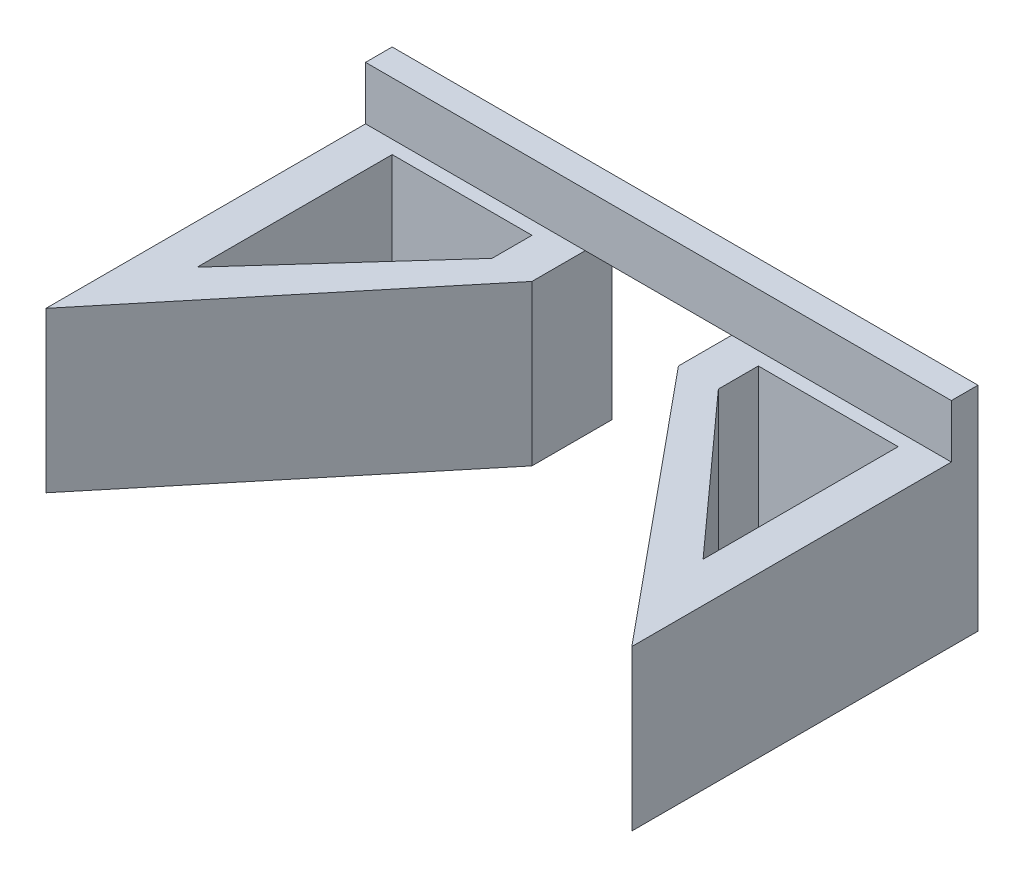
ISO-10303-21;
HEADER;
FILE_DESCRIPTION(('STEP AP214'),'2;1');
FILE_NAME('part.step','',(''),(''),'','','');
FILE_SCHEMA(('AUTOMOTIVE_DESIGN { 1 0 10303 214 1 1 1 1 }'));
ENDSEC;
DATA;
#1=APPLICATION_CONTEXT('core data for automotive mechanical design processes');
#2=APPLICATION_PROTOCOL_DEFINITION('international standard','automotive_design',2000,#1);
#3=PRODUCT_CONTEXT('',#1,'mechanical');
#4=PRODUCT('Part','Part','',(#3));
#5=PRODUCT_RELATED_PRODUCT_CATEGORY('part','',(#4));
#6=PRODUCT_DEFINITION_FORMATION('','',#4);
#7=PRODUCT_DEFINITION_CONTEXT('part definition',#1,'design');
#8=PRODUCT_DEFINITION('design','',#6,#7);
#9=PRODUCT_DEFINITION_SHAPE('','',#8);
#10=(LENGTH_UNIT() NAMED_UNIT(*) SI_UNIT(.MILLI.,.METRE.));
#11=(NAMED_UNIT(*) PLANE_ANGLE_UNIT() SI_UNIT($,.RADIAN.));
#12=(NAMED_UNIT(*) SI_UNIT($,.STERADIAN.) SOLID_ANGLE_UNIT());
#13=UNCERTAINTY_MEASURE_WITH_UNIT(LENGTH_MEASURE(1.E-05),#10,'distance_accuracy_value','');
#14=(GEOMETRIC_REPRESENTATION_CONTEXT(3) GLOBAL_UNCERTAINTY_ASSIGNED_CONTEXT((#13)) GLOBAL_UNIT_ASSIGNED_CONTEXT((#10,
#11,#12)) REPRESENTATION_CONTEXT('',''));
#15=CARTESIAN_POINT('',(0.,0.,0.));
#16=DIRECTION('',(0.,0.,1.));
#17=DIRECTION('',(1.,0.,0.));
#18=AXIS2_PLACEMENT_3D('',#15,#16,#17);
#19=CARTESIAN_POINT('',(0.,60.,0.));
#20=DIRECTION('',(0.,1.,0.));
#21=DIRECTION('',(0.,0.,1.));
#22=AXIS2_PLACEMENT_3D('',#19,#20,#21);
#23=PLANE('',#22);
#24=DIRECTION('',(0.,0.,1.));
#25=VECTOR('',#24,1.);
#26=CARTESIAN_POINT('',(27.5,60.,-12.7008032128514));
#27=LINE('',#26,#25);
#28=CARTESIAN_POINT('',(27.5,60.,-42.7008032128514));
#29=VERTEX_POINT('',#28);
#30=CARTESIAN_POINT('',(27.5,60.,-32.7008032128514));
#31=VERTEX_POINT('',#30);
#32=EDGE_CURVE('E215',#29,#31,#27,.T.);
#33=ORIENTED_EDGE('',*,*,#32,.T.);
#34=DIRECTION('',(1.,0.,0.));
#35=VECTOR('',#34,1.);
#36=CARTESIAN_POINT('',(-110.,60.,-32.7008032128514));
#37=LINE('',#36,#35);
#38=CARTESIAN_POINT('',(-27.5,60.,-32.7008032128514));
#39=VERTEX_POINT('',#38);
#40=EDGE_CURVE('E239',#39,#31,#37,.T.);
#41=ORIENTED_EDGE('',*,*,#40,.F.);
#42=DIRECTION('',(0.,0.,-1.));
#43=VECTOR('',#42,1.);
#44=CARTESIAN_POINT('',(-27.5,60.,-12.7008032128514));
#45=LINE('',#44,#43);
#46=CARTESIAN_POINT('',(-27.5,60.,-42.7008032128514));
#47=VERTEX_POINT('',#46);
#48=EDGE_CURVE('E296',#39,#47,#45,.T.);
#49=ORIENTED_EDGE('',*,*,#48,.T.);
#50=DIRECTION('',(-1.,0.,0.));
#51=VECTOR('',#50,1.);
#52=CARTESIAN_POINT('',(-110.,60.,-42.7008032128514));
#53=LINE('',#52,#51);
#54=EDGE_CURVE('E244',#29,#47,#53,.T.);
#55=ORIENTED_EDGE('',*,*,#54,.F.);
#56=EDGE_LOOP('',(#33,#41,#49,#55));
#57=FACE_BOUND('',#56,.T.);
#58=ADVANCED_FACE('F36',(#57),#23,.F.);
#59=CARTESIAN_POINT('',(0.,60.,0.));
#60=DIRECTION('',(0.,1.,0.));
#61=DIRECTION('',(0.,0.,1.));
#62=AXIS2_PLACEMENT_3D('',#59,#60,#61);
#63=PLANE('',#62);
#64=CARTESIAN_POINT('',(-110.,60.,-32.7008032128514));
#65=VERTEX_POINT('',#64);
#66=EDGE_CURVE('E51',#65,#39,#37,.T.);
#67=ORIENTED_EDGE('',*,*,#66,.F.);
#68=DIRECTION('',(0.,0.,1.));
#69=VECTOR('',#68,1.);
#70=CARTESIAN_POINT('',(-110.,60.,-42.7008032128514));
#71=LINE('',#70,#69);
#72=CARTESIAN_POINT('',(-110.,60.,87.2991967871486));
#73=VERTEX_POINT('',#72);
#74=EDGE_CURVE('E291',#65,#73,#71,.T.);
#75=ORIENTED_EDGE('',*,*,#74,.T.);
#76=DIRECTION('',(0.636382954795564,0.,-0.771373278540077));
#77=VECTOR('',#76,1.);
#78=CARTESIAN_POINT('',(-110.,60.,87.2991967871486));
#79=LINE('',#78,#77);
#80=CARTESIAN_POINT('',(-27.5,60.,-12.7008032128514));
#81=VERTEX_POINT('',#80);
#82=EDGE_CURVE('E293',#73,#81,#79,.T.);
#83=ORIENTED_EDGE('',*,*,#82,.T.);
#84=EDGE_CURVE('E297',#81,#39,#45,.T.);
#85=ORIENTED_EDGE('',*,*,#84,.T.);
#86=EDGE_LOOP('',(#67,#75,#83,#85));
#87=FACE_BOUND('',#86,.T.);
#88=DIRECTION('',(0.,0.,1.));
#89=VECTOR('',#88,1.);
#90=CARTESIAN_POINT('',(-95.,60.,-27.7008032128514));
#91=LINE('',#90,#89);
#92=CARTESIAN_POINT('',(-95.,60.,-27.7008032128514));
#93=VERTEX_POINT('',#92);
#94=CARTESIAN_POINT('',(-95.,60.,45.5466655826683));
#95=VERTEX_POINT('',#94);
#96=EDGE_CURVE('E264',#93,#95,#91,.T.);
#97=ORIENTED_EDGE('',*,*,#96,.F.);
#98=DIRECTION('',(-1.,0.,0.));
#99=VECTOR('',#98,1.);
#100=CARTESIAN_POINT('',(-42.5,60.,-27.7008032128514));
#101=LINE('',#100,#99);
#102=CARTESIAN_POINT('',(-42.5,60.,-27.7008032128514));
#103=VERTEX_POINT('',#102);
#104=EDGE_CURVE('E262',#103,#93,#101,.T.);
#105=ORIENTED_EDGE('',*,*,#104,.F.);
#106=DIRECTION('',(0.,0.,-1.));
#107=VECTOR('',#106,1.);
#108=CARTESIAN_POINT('',(-42.5,60.,-12.7008032128502));
#109=LINE('',#108,#107);
#110=CARTESIAN_POINT('',(-42.5,60.,-12.7008032128502));
#111=VERTEX_POINT('',#110);
#112=EDGE_CURVE('E269',#111,#103,#109,.T.);
#113=ORIENTED_EDGE('',*,*,#112,.F.);
#114=DIRECTION('',(0.669509023335629,0.,-0.742803922763048));
#115=VECTOR('',#114,1.);
#116=CARTESIAN_POINT('',(-95.,60.,45.5466655826683));
#117=LINE('',#116,#115);
#118=EDGE_CURVE('E267',#95,#111,#117,.T.);
#119=ORIENTED_EDGE('',*,*,#118,.F.);
#120=EDGE_LOOP('',(#97,#105,#113,#119));
#121=FACE_BOUND('',#120,.T.);
#122=ADVANCED_FACE('F375',(#87,#121),#63,.T.);
#123=CARTESIAN_POINT('',(0.,0.,0.));
#124=DIRECTION('',(0.,1.,0.));
#125=DIRECTION('',(0.,0.,1.));
#126=AXIS2_PLACEMENT_3D('',#123,#124,#125);
#127=PLANE('',#126);
#128=DIRECTION('',(0.,0.,1.));
#129=VECTOR('',#128,1.);
#130=CARTESIAN_POINT('',(-110.,0.,-12.7008032128514));
#131=LINE('',#130,#129);
#132=CARTESIAN_POINT('',(-110.,0.,-42.7008032128514));
#133=VERTEX_POINT('',#132);
#134=CARTESIAN_POINT('',(-110.,0.,87.2991967871486));
#135=VERTEX_POINT('',#134);
#136=EDGE_CURVE('E290',#133,#135,#131,.T.);
#137=ORIENTED_EDGE('',*,*,#136,.F.);
#138=DIRECTION('',(-1.,0.,0.));
#139=VECTOR('',#138,1.);
#140=CARTESIAN_POINT('',(-110.,0.,-42.7008032128514));
#141=LINE('',#140,#139);
#142=CARTESIAN_POINT('',(-27.5,0.,-42.7008032128514));
#143=VERTEX_POINT('',#142);
#144=EDGE_CURVE('E294',#143,#133,#141,.T.);
#145=ORIENTED_EDGE('',*,*,#144,.F.);
#146=DIRECTION('',(0.,0.,-1.));
#147=VECTOR('',#146,1.);
#148=CARTESIAN_POINT('',(-27.5,0.,-12.7008032128514));
#149=LINE('',#148,#147);
#150=CARTESIAN_POINT('',(-27.5,0.,-12.7008032128514));
#151=VERTEX_POINT('',#150);
#152=EDGE_CURVE('E303',#151,#143,#149,.T.);
#153=ORIENTED_EDGE('',*,*,#152,.F.);
#154=DIRECTION('',(0.636382954795564,0.,-0.771373278540077));
#155=VECTOR('',#154,1.);
#156=CARTESIAN_POINT('',(-110.,0.,87.2991967871486));
#157=LINE('',#156,#155);
#158=EDGE_CURVE('E301',#135,#151,#157,.T.);
#159=ORIENTED_EDGE('',*,*,#158,.F.);
#160=EDGE_LOOP('',(#137,#145,#153,#159));
#161=FACE_BOUND('',#160,.T.);
#162=DIRECTION('',(-1.,0.,0.));
#163=VECTOR('',#162,1.);
#164=CARTESIAN_POINT('',(-42.5,0.,-27.7008032128514));
#165=LINE('',#164,#163);
#166=CARTESIAN_POINT('',(-42.5,0.,-27.7008032128514));
#167=VERTEX_POINT('',#166);
#168=CARTESIAN_POINT('',(-95.,0.,-27.7008032128514));
#169=VERTEX_POINT('',#168);
#170=EDGE_CURVE('E261',#167,#169,#165,.T.);
#171=ORIENTED_EDGE('',*,*,#170,.T.);
#172=DIRECTION('',(0.,0.,1.));
#173=VECTOR('',#172,1.);
#174=CARTESIAN_POINT('',(-95.,0.,-27.7008032128514));
#175=LINE('',#174,#173);
#176=CARTESIAN_POINT('',(-95.,0.,45.5466655826683));
#177=VERTEX_POINT('',#176);
#178=EDGE_CURVE('E274',#169,#177,#175,.T.);
#179=ORIENTED_EDGE('',*,*,#178,.T.);
#180=DIRECTION('',(0.669509023335629,0.,-0.742803922763048));
#181=VECTOR('',#180,1.);
#182=CARTESIAN_POINT('',(-95.,0.,45.5466655826683));
#183=LINE('',#182,#181);
#184=CARTESIAN_POINT('',(-42.5,0.,-12.7008032128502));
#185=VERTEX_POINT('',#184);
#186=EDGE_CURVE('E277',#177,#185,#183,.T.);
#187=ORIENTED_EDGE('',*,*,#186,.T.);
#188=DIRECTION('',(0.,0.,-1.));
#189=VECTOR('',#188,1.);
#190=CARTESIAN_POINT('',(-42.5,0.,-12.7008032128502));
#191=LINE('',#190,#189);
#192=EDGE_CURVE('E265',#185,#167,#191,.T.);
#193=ORIENTED_EDGE('',*,*,#192,.T.);
#194=EDGE_LOOP('',(#171,#179,#187,#193));
#195=FACE_BOUND('',#194,.T.);
#196=ADVANCED_FACE('F324',(#161,#195),#127,.F.);
#197=CARTESIAN_POINT('',(-110.,60.,-12.7008032128514));
#198=DIRECTION('',(1.,0.,0.));
#199=DIRECTION('',(0.,0.,-1.));
#200=AXIS2_PLACEMENT_3D('',#197,#198,#199);
#201=PLANE('',#200);
#202=ORIENTED_EDGE('',*,*,#136,.T.);
#203=DIRECTION('',(0.,-1.,0.));
#204=VECTOR('',#203,1.);
#205=CARTESIAN_POINT('',(-110.,60.,87.2991967871486));
#206=LINE('',#205,#204);
#207=EDGE_CURVE('E11',#73,#135,#206,.T.);
#208=ORIENTED_EDGE('',*,*,#207,.F.);
#209=ORIENTED_EDGE('',*,*,#74,.F.);
#210=DIRECTION('',(0.,-1.,0.));
#211=VECTOR('',#210,1.);
#212=CARTESIAN_POINT('',(-110.,80.,-32.7008032128514));
#213=LINE('',#212,#211);
#214=CARTESIAN_POINT('',(-110.,80.,-32.7008032128514));
#215=VERTEX_POINT('',#214);
#216=EDGE_CURVE('E258',#215,#65,#213,.T.);
#217=ORIENTED_EDGE('',*,*,#216,.F.);
#218=DIRECTION('',(0.,0.,1.));
#219=VECTOR('',#218,1.);
#220=CARTESIAN_POINT('',(-110.,80.,-42.7008032128514));
#221=LINE('',#220,#219);
#222=CARTESIAN_POINT('',(-110.,80.,-42.7008032128514));
#223=VERTEX_POINT('',#222);
#224=EDGE_CURVE('E240',#223,#215,#221,.T.);
#225=ORIENTED_EDGE('',*,*,#224,.F.);
#226=DIRECTION('',(0.,-1.,0.));
#227=VECTOR('',#226,1.);
#228=CARTESIAN_POINT('',(-110.,60.,-42.7008032128514));
#229=LINE('',#228,#227);
#230=EDGE_CURVE('E299',#223,#133,#229,.T.);
#231=ORIENTED_EDGE('',*,*,#230,.T.);
#232=EDGE_LOOP('',(#202,#208,#209,#217,#225,#231));
#233=FACE_BOUND('',#232,.T.);
#234=ADVANCED_FACE('F38',(#233),#201,.F.);
#235=CARTESIAN_POINT('',(-110.,60.,87.2991967871486));
#236=DIRECTION('',(-0.771373278540077,0.,-0.636382954795564));
#237=DIRECTION('',(-0.636382954795564,0.,0.771373278540077));
#238=AXIS2_PLACEMENT_3D('',#235,#236,#237);
#239=PLANE('',#238);
#240=ORIENTED_EDGE('',*,*,#158,.T.);
#241=DIRECTION('',(0.,-1.,0.));
#242=VECTOR('',#241,1.);
#243=CARTESIAN_POINT('',(-27.5,60.,-12.7008032128514));
#244=LINE('',#243,#242);
#245=EDGE_CURVE('E44',#81,#151,#244,.T.);
#246=ORIENTED_EDGE('',*,*,#245,.F.);
#247=ORIENTED_EDGE('',*,*,#82,.F.);
#248=ORIENTED_EDGE('',*,*,#207,.T.);
#249=EDGE_LOOP('',(#240,#246,#247,#248));
#250=FACE_BOUND('',#249,.T.);
#251=ADVANCED_FACE('F469',(#250),#239,.F.);
#252=CARTESIAN_POINT('',(-27.5,60.,-12.7008032128514));
#253=DIRECTION('',(-1.,0.,0.));
#254=DIRECTION('',(0.,0.,1.));
#255=AXIS2_PLACEMENT_3D('',#252,#253,#254);
#256=PLANE('',#255);
#257=ORIENTED_EDGE('',*,*,#152,.T.);
#258=DIRECTION('',(0.,-1.,0.));
#259=VECTOR('',#258,1.);
#260=CARTESIAN_POINT('',(-27.5,60.,-42.7008032128514));
#261=LINE('',#260,#259);
#262=EDGE_CURVE('E309',#47,#143,#261,.T.);
#263=ORIENTED_EDGE('',*,*,#262,.F.);
#264=ORIENTED_EDGE('',*,*,#48,.F.);
#265=ORIENTED_EDGE('',*,*,#84,.F.);
#266=ORIENTED_EDGE('',*,*,#245,.T.);
#267=EDGE_LOOP('',(#257,#263,#264,#265,#266));
#268=FACE_BOUND('',#267,.T.);
#269=ADVANCED_FACE('F316',(#268),#256,.F.);
#270=CARTESIAN_POINT('',(-110.,60.,-42.7008032128514));
#271=DIRECTION('',(0.,0.,1.));
#272=DIRECTION('',(1.,0.,0.));
#273=AXIS2_PLACEMENT_3D('',#270,#271,#272);
#274=PLANE('',#273);
#275=ORIENTED_EDGE('',*,*,#144,.T.);
#276=ORIENTED_EDGE('',*,*,#230,.F.);
#277=DIRECTION('',(-1.,0.,0.));
#278=VECTOR('',#277,1.);
#279=CARTESIAN_POINT('',(-110.,80.,-42.7008032128514));
#280=LINE('',#279,#278);
#281=CARTESIAN_POINT('',(110.,80.,-42.7008032128514));
#282=VERTEX_POINT('',#281);
#283=EDGE_CURVE('E248',#282,#223,#280,.T.);
#284=ORIENTED_EDGE('',*,*,#283,.F.);
#285=DIRECTION('',(0.,-1.,0.));
#286=VECTOR('',#285,1.);
#287=CARTESIAN_POINT('',(110.,80.,-42.7008032128514));
#288=LINE('',#287,#286);
#289=CARTESIAN_POINT('',(110.,0.,-42.7008032128514));
#290=VERTEX_POINT('',#289);
#291=EDGE_CURVE('E251',#282,#290,#288,.T.);
#292=ORIENTED_EDGE('',*,*,#291,.T.);
#293=DIRECTION('',(-1.,0.,0.));
#294=VECTOR('',#293,1.);
#295=CARTESIAN_POINT('',(110.,0.,-42.7008032128514));
#296=LINE('',#295,#294);
#297=CARTESIAN_POINT('',(27.5,0.,-42.7008032128514));
#298=VERTEX_POINT('',#297);
#299=EDGE_CURVE('E186',#290,#298,#296,.T.);
#300=ORIENTED_EDGE('',*,*,#299,.T.);
#301=DIRECTION('',(0.,-1.,0.));
#302=VECTOR('',#301,1.);
#303=CARTESIAN_POINT('',(27.5,60.,-42.7008032128514));
#304=LINE('',#303,#302);
#305=EDGE_CURVE('E234',#29,#298,#304,.T.);
#306=ORIENTED_EDGE('',*,*,#305,.F.);
#307=ORIENTED_EDGE('',*,*,#54,.T.);
#308=ORIENTED_EDGE('',*,*,#262,.T.);
#309=EDGE_LOOP('',(#275,#276,#284,#292,#300,#306,#307,#308));
#310=FACE_BOUND('',#309,.T.);
#311=ADVANCED_FACE('F327',(#310),#274,.F.);
#312=CARTESIAN_POINT('',(-42.5,60.,-27.7008032128514));
#313=DIRECTION('',(0.,0.,1.));
#314=DIRECTION('',(1.,0.,0.));
#315=AXIS2_PLACEMENT_3D('',#312,#313,#314);
#316=PLANE('',#315);
#317=ORIENTED_EDGE('',*,*,#170,.F.);
#318=DIRECTION('',(0.,-1.,0.));
#319=VECTOR('',#318,1.);
#320=CARTESIAN_POINT('',(-42.5,60.,-27.7008032128514));
#321=LINE('',#320,#319);
#322=EDGE_CURVE('E271',#103,#167,#321,.T.);
#323=ORIENTED_EDGE('',*,*,#322,.F.);
#324=ORIENTED_EDGE('',*,*,#104,.T.);
#325=DIRECTION('',(0.,-1.,0.));
#326=VECTOR('',#325,1.);
#327=CARTESIAN_POINT('',(-95.,60.,-27.7008032128514));
#328=LINE('',#327,#326);
#329=EDGE_CURVE('E287',#93,#169,#328,.T.);
#330=ORIENTED_EDGE('',*,*,#329,.T.);
#331=EDGE_LOOP('',(#317,#323,#324,#330));
#332=FACE_BOUND('',#331,.T.);
#333=ADVANCED_FACE('F457',(#332),#316,.T.);
#334=CARTESIAN_POINT('',(-95.,60.,-27.7008032128514));
#335=DIRECTION('',(1.,0.,0.));
#336=DIRECTION('',(0.,0.,-1.));
#337=AXIS2_PLACEMENT_3D('',#334,#335,#336);
#338=PLANE('',#337);
#339=ORIENTED_EDGE('',*,*,#178,.F.);
#340=ORIENTED_EDGE('',*,*,#329,.F.);
#341=ORIENTED_EDGE('',*,*,#96,.T.);
#342=DIRECTION('',(0.,-1.,0.));
#343=VECTOR('',#342,1.);
#344=CARTESIAN_POINT('',(-95.,60.,45.5466655826683));
#345=LINE('',#344,#343);
#346=EDGE_CURVE('E285',#95,#177,#345,.T.);
#347=ORIENTED_EDGE('',*,*,#346,.T.);
#348=EDGE_LOOP('',(#339,#340,#341,#347));
#349=FACE_BOUND('',#348,.T.);
#350=ADVANCED_FACE('F506',(#349),#338,.T.);
#351=CARTESIAN_POINT('',(-95.,60.,45.5466655826683));
#352=DIRECTION('',(-0.742803922763048,0.,-0.669509023335629));
#353=DIRECTION('',(-0.669509023335629,0.,0.742803922763048));
#354=AXIS2_PLACEMENT_3D('',#351,#352,#353);
#355=PLANE('',#354);
#356=ORIENTED_EDGE('',*,*,#186,.F.);
#357=ORIENTED_EDGE('',*,*,#346,.F.);
#358=ORIENTED_EDGE('',*,*,#118,.T.);
#359=DIRECTION('',(0.,-1.,0.));
#360=VECTOR('',#359,1.);
#361=CARTESIAN_POINT('',(-42.5,60.,-12.7008032128502));
#362=LINE('',#361,#360);
#363=EDGE_CURVE('E59',#111,#185,#362,.T.);
#364=ORIENTED_EDGE('',*,*,#363,.T.);
#365=EDGE_LOOP('',(#356,#357,#358,#364));
#366=FACE_BOUND('',#365,.T.);
#367=ADVANCED_FACE('F372',(#366),#355,.T.);
#368=CARTESIAN_POINT('',(-42.5,60.,-12.7008032128502));
#369=DIRECTION('',(-1.,0.,0.));
#370=DIRECTION('',(0.,0.,1.));
#371=AXIS2_PLACEMENT_3D('',#368,#369,#370);
#372=PLANE('',#371);
#373=ORIENTED_EDGE('',*,*,#192,.F.);
#374=ORIENTED_EDGE('',*,*,#363,.F.);
#375=ORIENTED_EDGE('',*,*,#112,.T.);
#376=ORIENTED_EDGE('',*,*,#322,.T.);
#377=EDGE_LOOP('',(#373,#374,#375,#376));
#378=FACE_BOUND('',#377,.T.);
#379=ADVANCED_FACE('F365',(#378),#372,.T.);
#380=CARTESIAN_POINT('',(-110.,80.,-32.7008032128514));
#381=DIRECTION('',(0.,0.,-1.));
#382=DIRECTION('',(-1.,0.,0.));
#383=AXIS2_PLACEMENT_3D('',#380,#381,#382);
#384=PLANE('',#383);
#385=ORIENTED_EDGE('',*,*,#66,.T.);
#386=ORIENTED_EDGE('',*,*,#40,.T.);
#387=DIRECTION('',(-1.,0.,0.));
#388=VECTOR('',#387,1.);
#389=CARTESIAN_POINT('',(-110.,60.,-32.7008032128514));
#390=LINE('',#389,#388);
#391=CARTESIAN_POINT('',(110.,60.,-32.7008032128514));
#392=VERTEX_POINT('',#391);
#393=EDGE_CURVE('E237',#392,#31,#390,.T.);
#394=ORIENTED_EDGE('',*,*,#393,.F.);
#395=DIRECTION('',(0.,-1.,0.));
#396=VECTOR('',#395,1.);
#397=CARTESIAN_POINT('',(110.,80.,-32.7008032128514));
#398=LINE('',#397,#396);
#399=CARTESIAN_POINT('',(110.,80.,-32.7008032128514));
#400=VERTEX_POINT('',#399);
#401=EDGE_CURVE('E255',#400,#392,#398,.T.);
#402=ORIENTED_EDGE('',*,*,#401,.F.);
#403=DIRECTION('',(1.,0.,0.));
#404=VECTOR('',#403,1.);
#405=CARTESIAN_POINT('',(-110.,80.,-32.7008032128514));
#406=LINE('',#405,#404);
#407=EDGE_CURVE('E243',#215,#400,#406,.T.);
#408=ORIENTED_EDGE('',*,*,#407,.F.);
#409=ORIENTED_EDGE('',*,*,#216,.T.);
#410=EDGE_LOOP('',(#385,#386,#394,#402,#408,#409));
#411=FACE_BOUND('',#410,.T.);
#412=ADVANCED_FACE('F363',(#411),#384,.F.);
#413=CARTESIAN_POINT('',(110.,80.,-42.7008032128514));
#414=DIRECTION('',(-1.,0.,0.));
#415=DIRECTION('',(0.,0.,1.));
#416=AXIS2_PLACEMENT_3D('',#413,#414,#415);
#417=PLANE('',#416);
#418=ORIENTED_EDGE('',*,*,#401,.T.);
#419=DIRECTION('',(0.,0.,-1.));
#420=VECTOR('',#419,1.);
#421=CARTESIAN_POINT('',(110.,60.,-42.7008032128514));
#422=LINE('',#421,#420);
#423=CARTESIAN_POINT('',(110.,60.,87.2991967871486));
#424=VERTEX_POINT('',#423);
#425=EDGE_CURVE('E211',#424,#392,#422,.T.);
#426=ORIENTED_EDGE('',*,*,#425,.F.);
#427=DIRECTION('',(0.,-1.,0.));
#428=VECTOR('',#427,1.);
#429=CARTESIAN_POINT('',(110.,60.,87.2991967871486));
#430=LINE('',#429,#428);
#431=CARTESIAN_POINT('',(110.,0.,87.2991967871486));
#432=VERTEX_POINT('',#431);
#433=EDGE_CURVE('E221',#424,#432,#430,.T.);
#434=ORIENTED_EDGE('',*,*,#433,.T.);
#435=DIRECTION('',(0.,0.,-1.));
#436=VECTOR('',#435,1.);
#437=CARTESIAN_POINT('',(110.,0.,-12.7008032128514));
#438=LINE('',#437,#436);
#439=EDGE_CURVE('E214',#432,#290,#438,.T.);
#440=ORIENTED_EDGE('',*,*,#439,.T.);
#441=ORIENTED_EDGE('',*,*,#291,.F.);
#442=DIRECTION('',(0.,0.,-1.));
#443=VECTOR('',#442,1.);
#444=CARTESIAN_POINT('',(110.,80.,-42.7008032128514));
#445=LINE('',#444,#443);
#446=EDGE_CURVE('E246',#400,#282,#445,.T.);
#447=ORIENTED_EDGE('',*,*,#446,.F.);
#448=EDGE_LOOP('',(#418,#426,#434,#440,#441,#447));
#449=FACE_BOUND('',#448,.T.);
#450=ADVANCED_FACE('F341',(#449),#417,.F.);
#451=CARTESIAN_POINT('',(0.,80.,0.));
#452=DIRECTION('',(0.,1.,0.));
#453=DIRECTION('',(0.,0.,1.));
#454=AXIS2_PLACEMENT_3D('',#451,#452,#453);
#455=PLANE('',#454);
#456=ORIENTED_EDGE('',*,*,#224,.T.);
#457=ORIENTED_EDGE('',*,*,#407,.T.);
#458=ORIENTED_EDGE('',*,*,#446,.T.);
#459=ORIENTED_EDGE('',*,*,#283,.T.);
#460=EDGE_LOOP('',(#456,#457,#458,#459));
#461=FACE_BOUND('',#460,.T.);
#462=ADVANCED_FACE('F334',(#461),#455,.T.);
#463=CARTESIAN_POINT('',(0.,60.,0.));
#464=DIRECTION('',(0.,-1.,0.));
#465=DIRECTION('',(0.,0.,-1.));
#466=AXIS2_PLACEMENT_3D('',#463,#464,#465);
#467=PLANE('',#466);
#468=DIRECTION('',(0.669509023335629,0.,0.742803922763048));
#469=VECTOR('',#468,1.);
#470=CARTESIAN_POINT('',(95.,60.,45.5466655826682));
#471=LINE('',#470,#469);
#472=CARTESIAN_POINT('',(42.5,60.,-12.7008032128502));
#473=VERTEX_POINT('',#472);
#474=CARTESIAN_POINT('',(95.,60.,45.5466655826682));
#475=VERTEX_POINT('',#474);
#476=EDGE_CURVE('E168',#473,#475,#471,.T.);
#477=ORIENTED_EDGE('',*,*,#476,.F.);
#478=DIRECTION('',(0.,0.,1.));
#479=VECTOR('',#478,1.);
#480=CARTESIAN_POINT('',(42.5,60.,-12.7008032128502));
#481=LINE('',#480,#479);
#482=CARTESIAN_POINT('',(42.5,60.,-27.7008032128514));
#483=VERTEX_POINT('',#482);
#484=EDGE_CURVE('E195',#483,#473,#481,.T.);
#485=ORIENTED_EDGE('',*,*,#484,.F.);
#486=DIRECTION('',(-1.,0.,0.));
#487=VECTOR('',#486,1.);
#488=CARTESIAN_POINT('',(42.5,60.,-27.7008032128514));
#489=LINE('',#488,#487);
#490=CARTESIAN_POINT('',(95.,60.,-27.7008032128514));
#491=VERTEX_POINT('',#490);
#492=EDGE_CURVE('E193',#491,#483,#489,.T.);
#493=ORIENTED_EDGE('',*,*,#492,.F.);
#494=DIRECTION('',(0.,0.,-1.));
#495=VECTOR('',#494,1.);
#496=CARTESIAN_POINT('',(95.,60.,-27.7008032128514));
#497=LINE('',#496,#495);
#498=EDGE_CURVE('E178',#475,#491,#497,.T.);
#499=ORIENTED_EDGE('',*,*,#498,.F.);
#500=EDGE_LOOP('',(#477,#485,#493,#499));
#501=FACE_BOUND('',#500,.T.);
#502=ORIENTED_EDGE('',*,*,#425,.T.);
#503=ORIENTED_EDGE('',*,*,#393,.T.);
#504=CARTESIAN_POINT('',(27.5,60.,-12.7008032128514));
#505=VERTEX_POINT('',#504);
#506=EDGE_CURVE('E213',#31,#505,#27,.T.);
#507=ORIENTED_EDGE('',*,*,#506,.T.);
#508=DIRECTION('',(0.636382954795564,0.,0.771373278540077));
#509=VECTOR('',#508,1.);
#510=CARTESIAN_POINT('',(110.,60.,87.2991967871486));
#511=LINE('',#510,#509);
#512=EDGE_CURVE('E218',#505,#424,#511,.T.);
#513=ORIENTED_EDGE('',*,*,#512,.T.);
#514=EDGE_LOOP('',(#502,#503,#507,#513));
#515=FACE_BOUND('',#514,.T.);
#516=ADVANCED_FACE('F190',(#501,#515),#467,.F.);
#517=CARTESIAN_POINT('',(0.,0.,0.));
#518=DIRECTION('',(0.,-1.,0.));
#519=DIRECTION('',(0.,0.,-1.));
#520=AXIS2_PLACEMENT_3D('',#517,#518,#519);
#521=PLANE('',#520);
#522=ORIENTED_EDGE('',*,*,#299,.F.);
#523=ORIENTED_EDGE('',*,*,#439,.F.);
#524=DIRECTION('',(0.636382954795564,0.,0.771373278540077));
#525=VECTOR('',#524,1.);
#526=CARTESIAN_POINT('',(110.,0.,87.2991967871486));
#527=LINE('',#526,#525);
#528=CARTESIAN_POINT('',(27.5,0.,-12.7008032128514));
#529=VERTEX_POINT('',#528);
#530=EDGE_CURVE('E225',#529,#432,#527,.T.);
#531=ORIENTED_EDGE('',*,*,#530,.F.);
#532=DIRECTION('',(0.,0.,1.));
#533=VECTOR('',#532,1.);
#534=CARTESIAN_POINT('',(27.5,0.,-12.7008032128514));
#535=LINE('',#534,#533);
#536=EDGE_CURVE('E223',#298,#529,#535,.T.);
#537=ORIENTED_EDGE('',*,*,#536,.F.);
#538=EDGE_LOOP('',(#522,#523,#531,#537));
#539=FACE_BOUND('',#538,.T.);
#540=DIRECTION('',(0.,0.,1.));
#541=VECTOR('',#540,1.);
#542=CARTESIAN_POINT('',(42.5,0.,-12.7008032128502));
#543=LINE('',#542,#541);
#544=CARTESIAN_POINT('',(42.5,0.,-27.7008032128514));
#545=VERTEX_POINT('',#544);
#546=CARTESIAN_POINT('',(42.5,0.,-12.7008032128502));
#547=VERTEX_POINT('',#546);
#548=EDGE_CURVE('E179',#545,#547,#543,.T.);
#549=ORIENTED_EDGE('',*,*,#548,.T.);
#550=DIRECTION('',(0.669509023335629,0.,0.742803922763048));
#551=VECTOR('',#550,1.);
#552=CARTESIAN_POINT('',(95.,0.,45.5466655826682));
#553=LINE('',#552,#551);
#554=CARTESIAN_POINT('',(95.,0.,45.5466655826682));
#555=VERTEX_POINT('',#554);
#556=EDGE_CURVE('E199',#547,#555,#553,.T.);
#557=ORIENTED_EDGE('',*,*,#556,.T.);
#558=DIRECTION('',(0.,0.,-1.));
#559=VECTOR('',#558,1.);
#560=CARTESIAN_POINT('',(95.,0.,-27.7008032128514));
#561=LINE('',#560,#559);
#562=CARTESIAN_POINT('',(95.,0.,-27.7008032128514));
#563=VERTEX_POINT('',#562);
#564=EDGE_CURVE('E185',#555,#563,#561,.T.);
#565=ORIENTED_EDGE('',*,*,#564,.T.);
#566=DIRECTION('',(-1.,0.,0.));
#567=VECTOR('',#566,1.);
#568=CARTESIAN_POINT('',(42.5,0.,-27.7008032128514));
#569=LINE('',#568,#567);
#570=EDGE_CURVE('E202',#563,#545,#569,.T.);
#571=ORIENTED_EDGE('',*,*,#570,.T.);
#572=EDGE_LOOP('',(#549,#557,#565,#571));
#573=FACE_BOUND('',#572,.T.);
#574=ADVANCED_FACE('F346',(#539,#573),#521,.T.);
#575=CARTESIAN_POINT('',(27.5,60.,-12.7008032128514));
#576=DIRECTION('',(1.,0.,0.));
#577=DIRECTION('',(0.,0.,-1.));
#578=AXIS2_PLACEMENT_3D('',#575,#576,#577);
#579=PLANE('',#578);
#580=ORIENTED_EDGE('',*,*,#536,.T.);
#581=DIRECTION('',(0.,-1.,0.));
#582=VECTOR('',#581,1.);
#583=CARTESIAN_POINT('',(27.5,60.,-12.7008032128514));
#584=LINE('',#583,#582);
#585=EDGE_CURVE('E231',#505,#529,#584,.T.);
#586=ORIENTED_EDGE('',*,*,#585,.F.);
#587=ORIENTED_EDGE('',*,*,#506,.F.);
#588=ORIENTED_EDGE('',*,*,#32,.F.);
#589=ORIENTED_EDGE('',*,*,#305,.T.);
#590=EDGE_LOOP('',(#580,#586,#587,#588,#589));
#591=FACE_BOUND('',#590,.T.);
#592=ADVANCED_FACE('F350',(#591),#579,.F.);
#593=CARTESIAN_POINT('',(110.,60.,87.2991967871486));
#594=DIRECTION('',(0.771373278540077,0.,-0.636382954795564));
#595=DIRECTION('',(-0.636382954795564,0.,-0.771373278540077));
#596=AXIS2_PLACEMENT_3D('',#593,#594,#595);
#597=PLANE('',#596);
#598=ORIENTED_EDGE('',*,*,#530,.T.);
#599=ORIENTED_EDGE('',*,*,#433,.F.);
#600=ORIENTED_EDGE('',*,*,#512,.F.);
#601=ORIENTED_EDGE('',*,*,#585,.T.);
#602=EDGE_LOOP('',(#598,#599,#600,#601));
#603=FACE_BOUND('',#602,.T.);
#604=ADVANCED_FACE('F355',(#603),#597,.F.);
#605=CARTESIAN_POINT('',(95.,60.,45.5466655826682));
#606=DIRECTION('',(0.742803922763048,0.,-0.669509023335629));
#607=DIRECTION('',(-0.669509023335629,0.,-0.742803922763048));
#608=AXIS2_PLACEMENT_3D('',#605,#606,#607);
#609=PLANE('',#608);
#610=ORIENTED_EDGE('',*,*,#556,.F.);
#611=DIRECTION('',(0.,-1.,0.));
#612=VECTOR('',#611,1.);
#613=CARTESIAN_POINT('',(42.5,60.,-12.7008032128502));
#614=LINE('',#613,#612);
#615=EDGE_CURVE('E174',#473,#547,#614,.T.);
#616=ORIENTED_EDGE('',*,*,#615,.F.);
#617=ORIENTED_EDGE('',*,*,#476,.T.);
#618=DIRECTION('',(0.,-1.,0.));
#619=VECTOR('',#618,1.);
#620=CARTESIAN_POINT('',(95.,60.,45.5466655826682));
#621=LINE('',#620,#619);
#622=EDGE_CURVE('E171',#475,#555,#621,.T.);
#623=ORIENTED_EDGE('',*,*,#622,.T.);
#624=EDGE_LOOP('',(#610,#616,#617,#623));
#625=FACE_BOUND('',#624,.T.);
#626=ADVANCED_FACE('F170',(#625),#609,.T.);
#627=CARTESIAN_POINT('',(95.,60.,-27.7008032128514));
#628=DIRECTION('',(-1.,0.,0.));
#629=DIRECTION('',(0.,0.,1.));
#630=AXIS2_PLACEMENT_3D('',#627,#628,#629);
#631=PLANE('',#630);
#632=ORIENTED_EDGE('',*,*,#564,.F.);
#633=ORIENTED_EDGE('',*,*,#622,.F.);
#634=ORIENTED_EDGE('',*,*,#498,.T.);
#635=DIRECTION('',(0.,-1.,0.));
#636=VECTOR('',#635,1.);
#637=CARTESIAN_POINT('',(95.,60.,-27.7008032128514));
#638=LINE('',#637,#636);
#639=EDGE_CURVE('E187',#491,#563,#638,.T.);
#640=ORIENTED_EDGE('',*,*,#639,.T.);
#641=EDGE_LOOP('',(#632,#633,#634,#640));
#642=FACE_BOUND('',#641,.T.);
#643=ADVANCED_FACE('F182',(#642),#631,.T.);
#644=CARTESIAN_POINT('',(42.5,60.,-27.7008032128514));
#645=DIRECTION('',(0.,0.,1.));
#646=DIRECTION('',(1.,0.,0.));
#647=AXIS2_PLACEMENT_3D('',#644,#645,#646);
#648=PLANE('',#647);
#649=ORIENTED_EDGE('',*,*,#570,.F.);
#650=ORIENTED_EDGE('',*,*,#639,.F.);
#651=ORIENTED_EDGE('',*,*,#492,.T.);
#652=DIRECTION('',(0.,-1.,0.));
#653=VECTOR('',#652,1.);
#654=CARTESIAN_POINT('',(42.5,60.,-27.7008032128514));
#655=LINE('',#654,#653);
#656=EDGE_CURVE('E208',#483,#545,#655,.T.);
#657=ORIENTED_EDGE('',*,*,#656,.T.);
#658=EDGE_LOOP('',(#649,#650,#651,#657));
#659=FACE_BOUND('',#658,.T.);
#660=ADVANCED_FACE('F396',(#659),#648,.T.);
#661=CARTESIAN_POINT('',(42.5,60.,-12.7008032128502));
#662=DIRECTION('',(1.,0.,0.));
#663=DIRECTION('',(0.,0.,-1.));
#664=AXIS2_PLACEMENT_3D('',#661,#662,#663);
#665=PLANE('',#664);
#666=ORIENTED_EDGE('',*,*,#548,.F.);
#667=ORIENTED_EDGE('',*,*,#656,.F.);
#668=ORIENTED_EDGE('',*,*,#484,.T.);
#669=ORIENTED_EDGE('',*,*,#615,.T.);
#670=EDGE_LOOP('',(#666,#667,#668,#669));
#671=FACE_BOUND('',#670,.T.);
#672=ADVANCED_FACE('F399',(#671),#665,.T.);
#673=CLOSED_SHELL('',(#58,#122,#196,#234,#251,#269,#311,#333,#350,#367,#379,#412,#450,#462,#516,
#574,#592,#604,#626,#643,#660,#672));
#674=MANIFOLD_SOLID_BREP('B2',#673);
#675=ADVANCED_BREP_SHAPE_REPRESENTATION('',(#18,#674),#14);
#676=SHAPE_DEFINITION_REPRESENTATION(#9,#675);
ENDSEC;
END-ISO-10303-21;
